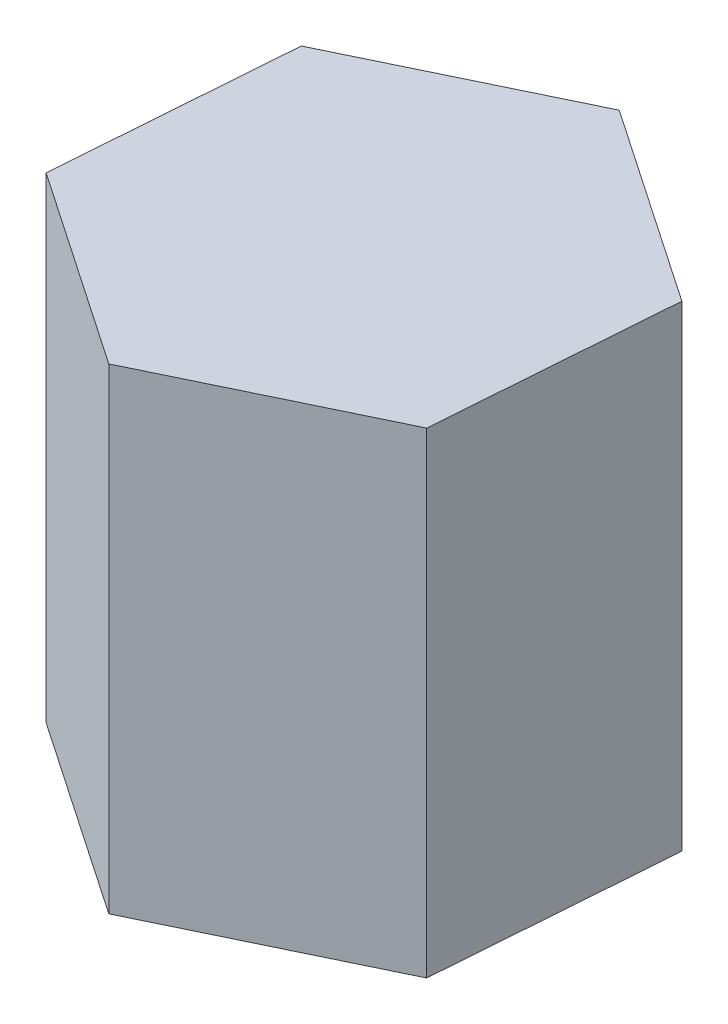
ISO-10303-21;
HEADER;
FILE_DESCRIPTION(('STEP AP214'),'2;1');
FILE_NAME('part.step','',(''),(''),'','','');
FILE_SCHEMA(('AUTOMOTIVE_DESIGN { 1 0 10303 214 1 1 1 1 }'));
ENDSEC;
DATA;
#1=APPLICATION_CONTEXT('core data for automotive mechanical design processes');
#2=APPLICATION_PROTOCOL_DEFINITION('international standard','automotive_design',2000,#1);
#3=PRODUCT_CONTEXT('',#1,'mechanical');
#4=PRODUCT('Part','Part','',(#3));
#5=PRODUCT_RELATED_PRODUCT_CATEGORY('part','',(#4));
#6=PRODUCT_DEFINITION_FORMATION('','',#4);
#7=PRODUCT_DEFINITION_CONTEXT('part definition',#1,'design');
#8=PRODUCT_DEFINITION('design','',#6,#7);
#9=PRODUCT_DEFINITION_SHAPE('','',#8);
#10=(LENGTH_UNIT() NAMED_UNIT(*) SI_UNIT(.MILLI.,.METRE.));
#11=(NAMED_UNIT(*) PLANE_ANGLE_UNIT() SI_UNIT($,.RADIAN.));
#12=(NAMED_UNIT(*) SI_UNIT($,.STERADIAN.) SOLID_ANGLE_UNIT());
#13=UNCERTAINTY_MEASURE_WITH_UNIT(LENGTH_MEASURE(1.E-05),#10,'distance_accuracy_value','');
#14=(GEOMETRIC_REPRESENTATION_CONTEXT(3) GLOBAL_UNCERTAINTY_ASSIGNED_CONTEXT((#13)) GLOBAL_UNIT_ASSIGNED_CONTEXT((#10,
#11,#12)) REPRESENTATION_CONTEXT('',''));
#15=CARTESIAN_POINT('',(0.,0.,0.));
#16=DIRECTION('',(0.,0.,1.));
#17=DIRECTION('',(1.,0.,0.));
#18=AXIS2_PLACEMENT_3D('',#15,#16,#17);
#19=CARTESIAN_POINT('',(-1.49132243556553,40.,19.9443214322568));
#20=DIRECTION('',(-0.434031880084749,0.,-0.900897511967981));
#21=DIRECTION('',(-0.900897511967981,0.,0.434031880084749));
#22=AXIS2_PLACEMENT_3D('',#19,#20,#21);
#23=PLANE('',#22);
#24=DIRECTION('',(0.900897511967981,0.,-0.434031880084749));
#25=VECTOR('',#24,1.);
#26=CARTESIAN_POINT('',(-1.49132243556553,0.,19.9443214322568));
#27=LINE('',#26,#25);
#28=CARTESIAN_POINT('',(-1.49132243556553,0.,19.9443214322568));
#29=VERTEX_POINT('',#28);
#30=CARTESIAN_POINT('',(16.5266278037941,0.,11.2636838305618));
#31=VERTEX_POINT('',#30);
#32=EDGE_CURVE('E125',#29,#31,#27,.T.);
#33=ORIENTED_EDGE('',*,*,#32,.T.);
#34=DIRECTION('',(0.,-1.,0.));
#35=VECTOR('',#34,1.);
#36=CARTESIAN_POINT('',(16.5266278037941,40.,11.2636838305618));
#37=LINE('',#36,#35);
#38=CARTESIAN_POINT('',(16.5266278037941,40.,11.2636838305618));
#39=VERTEX_POINT('',#38);
#40=EDGE_CURVE('E11',#39,#31,#37,.T.);
#41=ORIENTED_EDGE('',*,*,#40,.F.);
#42=DIRECTION('',(0.900897511967981,0.,-0.434031880084749));
#43=VECTOR('',#42,1.);
#44=CARTESIAN_POINT('',(-1.49132243556553,40.,19.9443214322568));
#45=LINE('',#44,#43);
#46=CARTESIAN_POINT('',(-1.49132243556553,40.,19.9443214322568));
#47=VERTEX_POINT('',#46);
#48=EDGE_CURVE('E135',#47,#39,#45,.T.);
#49=ORIENTED_EDGE('',*,*,#48,.F.);
#50=DIRECTION('',(0.,-1.,0.));
#51=VECTOR('',#50,1.);
#52=CARTESIAN_POINT('',(-1.49132243556553,40.,19.9443214322568));
#53=LINE('',#52,#51);
#54=EDGE_CURVE('E121',#47,#29,#53,.T.);
#55=ORIENTED_EDGE('',*,*,#54,.T.);
#56=EDGE_LOOP('',(#33,#41,#49,#55));
#57=FACE_BOUND('',#56,.T.);
#58=ADVANCED_FACE('F41',(#57),#23,.F.);
#59=CARTESIAN_POINT('',(16.5266278037941,40.,11.2636838305618));
#60=DIRECTION('',(-0.997216071612841,0.,-0.0745661217782764));
#61=DIRECTION('',(-0.0745661217782764,0.,0.997216071612841));
#62=AXIS2_PLACEMENT_3D('',#59,#60,#61);
#63=PLANE('',#62);
#64=DIRECTION('',(0.0745661217782764,0.,-0.997216071612841));
#65=VECTOR('',#64,1.);
#66=CARTESIAN_POINT('',(16.5266278037941,0.,11.2636838305618));
#67=LINE('',#66,#65);
#68=CARTESIAN_POINT('',(18.0179502393596,0.,-8.68063760169497));
#69=VERTEX_POINT('',#68);
#70=EDGE_CURVE('E128',#31,#69,#67,.T.);
#71=ORIENTED_EDGE('',*,*,#70,.T.);
#72=DIRECTION('',(0.,-1.,0.));
#73=VECTOR('',#72,1.);
#74=CARTESIAN_POINT('',(18.0179502393596,40.,-8.68063760169497));
#75=LINE('',#74,#73);
#76=CARTESIAN_POINT('',(18.0179502393596,40.,-8.68063760169497));
#77=VERTEX_POINT('',#76);
#78=EDGE_CURVE('E49',#77,#69,#75,.T.);
#79=ORIENTED_EDGE('',*,*,#78,.F.);
#80=DIRECTION('',(0.0745661217782764,0.,-0.997216071612841));
#81=VECTOR('',#80,1.);
#82=CARTESIAN_POINT('',(16.5266278037941,40.,11.2636838305618));
#83=LINE('',#82,#81);
#84=EDGE_CURVE('E94',#39,#77,#83,.T.);
#85=ORIENTED_EDGE('',*,*,#84,.F.);
#86=ORIENTED_EDGE('',*,*,#40,.T.);
#87=EDGE_LOOP('',(#71,#79,#85,#86));
#88=FACE_BOUND('',#87,.T.);
#89=ADVANCED_FACE('F159',(#88),#63,.F.);
#90=CARTESIAN_POINT('',(18.0179502393596,40.,-8.68063760169497));
#91=DIRECTION('',(-0.563184191528092,0.,0.826331390189704));
#92=DIRECTION('',(0.826331390189704,0.,0.563184191528092));
#93=AXIS2_PLACEMENT_3D('',#90,#91,#92);
#94=PLANE('',#93);
#95=DIRECTION('',(-0.826331390189704,0.,-0.563184191528092));
#96=VECTOR('',#95,1.);
#97=CARTESIAN_POINT('',(18.0179502393596,0.,-8.68063760169497));
#98=LINE('',#97,#96);
#99=CARTESIAN_POINT('',(1.49132243556553,0.,-19.9443214322568));
#100=VERTEX_POINT('',#99);
#101=EDGE_CURVE('E130',#69,#100,#98,.T.);
#102=ORIENTED_EDGE('',*,*,#101,.T.);
#103=DIRECTION('',(0.,-1.,0.));
#104=VECTOR('',#103,1.);
#105=CARTESIAN_POINT('',(1.49132243556553,40.,-19.9443214322568));
#106=LINE('',#105,#104);
#107=CARTESIAN_POINT('',(1.49132243556553,40.,-19.9443214322568));
#108=VERTEX_POINT('',#107);
#109=EDGE_CURVE('E116',#108,#100,#106,.T.);
#110=ORIENTED_EDGE('',*,*,#109,.F.);
#111=DIRECTION('',(-0.826331390189704,0.,-0.563184191528092));
#112=VECTOR('',#111,1.);
#113=CARTESIAN_POINT('',(18.0179502393596,40.,-8.68063760169497));
#114=LINE('',#113,#112);
#115=EDGE_CURVE('E107',#77,#108,#114,.T.);
#116=ORIENTED_EDGE('',*,*,#115,.F.);
#117=ORIENTED_EDGE('',*,*,#78,.T.);
#118=EDGE_LOOP('',(#102,#110,#116,#117));
#119=FACE_BOUND('',#118,.T.);
#120=ADVANCED_FACE('F141',(#119),#94,.F.);
#121=CARTESIAN_POINT('',(1.49132243556553,40.,-19.9443214322568));
#122=DIRECTION('',(0.434031880084749,0.,0.900897511967981));
#123=DIRECTION('',(0.900897511967981,0.,-0.434031880084749));
#124=AXIS2_PLACEMENT_3D('',#121,#122,#123);
#125=PLANE('',#124);
#126=DIRECTION('',(-0.900897511967981,0.,0.434031880084749));
#127=VECTOR('',#126,1.);
#128=CARTESIAN_POINT('',(1.49132243556553,0.,-19.9443214322568));
#129=LINE('',#128,#127);
#130=CARTESIAN_POINT('',(-16.5266278037941,0.,-11.2636838305618));
#131=VERTEX_POINT('',#130);
#132=EDGE_CURVE('E115',#100,#131,#129,.T.);
#133=ORIENTED_EDGE('',*,*,#132,.T.);
#134=DIRECTION('',(0.,-1.,0.));
#135=VECTOR('',#134,1.);
#136=CARTESIAN_POINT('',(-16.5266278037941,40.,-11.2636838305618));
#137=LINE('',#136,#135);
#138=CARTESIAN_POINT('',(-16.5266278037941,40.,-11.2636838305618));
#139=VERTEX_POINT('',#138);
#140=EDGE_CURVE('E112',#139,#131,#137,.T.);
#141=ORIENTED_EDGE('',*,*,#140,.F.);
#142=DIRECTION('',(-0.900897511967981,0.,0.434031880084749));
#143=VECTOR('',#142,1.);
#144=CARTESIAN_POINT('',(1.49132243556553,40.,-19.9443214322568));
#145=LINE('',#144,#143);
#146=EDGE_CURVE('E101',#108,#139,#145,.T.);
#147=ORIENTED_EDGE('',*,*,#146,.F.);
#148=ORIENTED_EDGE('',*,*,#109,.T.);
#149=EDGE_LOOP('',(#133,#141,#147,#148));
#150=FACE_BOUND('',#149,.T.);
#151=ADVANCED_FACE('F113',(#150),#125,.F.);
#152=CARTESIAN_POINT('',(-16.5266278037941,40.,-11.2636838305618));
#153=DIRECTION('',(0.997216071612841,0.,0.0745661217782761));
#154=DIRECTION('',(0.0745661217782761,0.,-0.997216071612841));
#155=AXIS2_PLACEMENT_3D('',#152,#153,#154);
#156=PLANE('',#155);
#157=DIRECTION('',(-0.0745661217782761,0.,0.997216071612841));
#158=VECTOR('',#157,1.);
#159=CARTESIAN_POINT('',(-16.5266278037941,0.,-11.2636838305618));
#160=LINE('',#159,#158);
#161=CARTESIAN_POINT('',(-18.0179502393596,0.,8.68063760169497));
#162=VERTEX_POINT('',#161);
#163=EDGE_CURVE('E80',#131,#162,#160,.T.);
#164=ORIENTED_EDGE('',*,*,#163,.T.);
#165=DIRECTION('',(0.,-1.,0.));
#166=VECTOR('',#165,1.);
#167=CARTESIAN_POINT('',(-18.0179502393596,40.,8.68063760169497));
#168=LINE('',#167,#166);
#169=CARTESIAN_POINT('',(-18.0179502393596,40.,8.68063760169497));
#170=VERTEX_POINT('',#169);
#171=EDGE_CURVE('E117',#170,#162,#168,.T.);
#172=ORIENTED_EDGE('',*,*,#171,.F.);
#173=DIRECTION('',(-0.0745661217782761,0.,0.997216071612841));
#174=VECTOR('',#173,1.);
#175=CARTESIAN_POINT('',(-16.5266278037941,40.,-11.2636838305618));
#176=LINE('',#175,#174);
#177=EDGE_CURVE('E105',#139,#170,#176,.T.);
#178=ORIENTED_EDGE('',*,*,#177,.F.);
#179=ORIENTED_EDGE('',*,*,#140,.T.);
#180=EDGE_LOOP('',(#164,#172,#178,#179));
#181=FACE_BOUND('',#180,.T.);
#182=ADVANCED_FACE('F119',(#181),#156,.F.);
#183=CARTESIAN_POINT('',(-18.0179502393596,40.,8.68063760169497));
#184=DIRECTION('',(0.563184191528093,0.,-0.826331390189704));
#185=DIRECTION('',(-0.826331390189704,0.,-0.563184191528093));
#186=AXIS2_PLACEMENT_3D('',#183,#184,#185);
#187=PLANE('',#186);
#188=DIRECTION('',(0.826331390189704,0.,0.563184191528093));
#189=VECTOR('',#188,1.);
#190=CARTESIAN_POINT('',(-18.0179502393596,0.,8.68063760169497));
#191=LINE('',#190,#189);
#192=EDGE_CURVE('E86',#162,#29,#191,.T.);
#193=ORIENTED_EDGE('',*,*,#192,.T.);
#194=ORIENTED_EDGE('',*,*,#54,.F.);
#195=DIRECTION('',(0.826331390189704,0.,0.563184191528093));
#196=VECTOR('',#195,1.);
#197=CARTESIAN_POINT('',(-18.0179502393596,40.,8.68063760169497));
#198=LINE('',#197,#196);
#199=EDGE_CURVE('E57',#170,#47,#198,.T.);
#200=ORIENTED_EDGE('',*,*,#199,.F.);
#201=ORIENTED_EDGE('',*,*,#171,.T.);
#202=EDGE_LOOP('',(#193,#194,#200,#201));
#203=FACE_BOUND('',#202,.T.);
#204=ADVANCED_FACE('F148',(#203),#187,.F.);
#205=CARTESIAN_POINT('',(0.,40.,0.));
#206=DIRECTION('',(0.,1.,0.));
#207=DIRECTION('',(0.,0.,1.));
#208=AXIS2_PLACEMENT_3D('',#205,#206,#207);
#209=PLANE('',#208);
#210=ORIENTED_EDGE('',*,*,#48,.T.);
#211=ORIENTED_EDGE('',*,*,#84,.T.);
#212=ORIENTED_EDGE('',*,*,#115,.T.);
#213=ORIENTED_EDGE('',*,*,#146,.T.);
#214=ORIENTED_EDGE('',*,*,#177,.T.);
#215=ORIENTED_EDGE('',*,*,#199,.T.);
#216=EDGE_LOOP('',(#210,#211,#212,#213,#214,#215));
#217=FACE_BOUND('',#216,.T.);
#218=ADVANCED_FACE('F103',(#217),#209,.T.);
#219=CARTESIAN_POINT('',(0.,0.,0.));
#220=DIRECTION('',(0.,1.,0.));
#221=DIRECTION('',(0.,0.,1.));
#222=AXIS2_PLACEMENT_3D('',#219,#220,#221);
#223=PLANE('',#222);
#224=ORIENTED_EDGE('',*,*,#32,.F.);
#225=ORIENTED_EDGE('',*,*,#192,.F.);
#226=ORIENTED_EDGE('',*,*,#163,.F.);
#227=ORIENTED_EDGE('',*,*,#132,.F.);
#228=ORIENTED_EDGE('',*,*,#101,.F.);
#229=ORIENTED_EDGE('',*,*,#70,.F.);
#230=EDGE_LOOP('',(#224,#225,#226,#227,#228,#229));
#231=FACE_BOUND('',#230,.T.);
#232=ADVANCED_FACE('F144',(#231),#223,.F.);
#233=CLOSED_SHELL('',(#58,#89,#120,#151,#182,#204,#218,#232));
#234=MANIFOLD_SOLID_BREP('B2',#233);
#235=ADVANCED_BREP_SHAPE_REPRESENTATION('',(#18,#234),#14);
#236=SHAPE_DEFINITION_REPRESENTATION(#9,#235);
ENDSEC;
END-ISO-10303-21;
